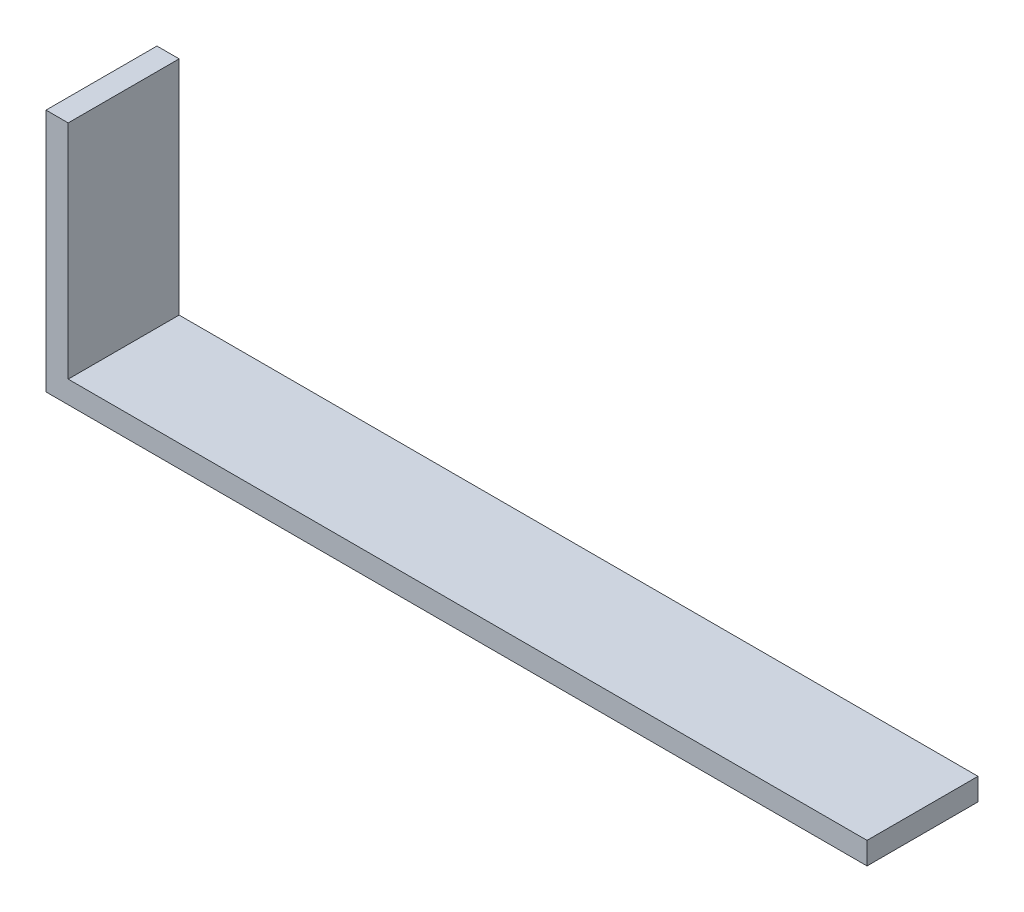
ISO-10303-21;
HEADER;
FILE_DESCRIPTION(('STEP AP214'),'2;1');
FILE_NAME('part.step','',(''),(''),'','','');
FILE_SCHEMA(('AUTOMOTIVE_DESIGN { 1 0 10303 214 1 1 1 1 }'));
ENDSEC;
DATA;
#1=APPLICATION_CONTEXT('core data for automotive mechanical design processes');
#2=APPLICATION_PROTOCOL_DEFINITION('international standard','automotive_design',2000,#1);
#3=PRODUCT_CONTEXT('',#1,'mechanical');
#4=PRODUCT('Part','Part','',(#3));
#5=PRODUCT_RELATED_PRODUCT_CATEGORY('part','',(#4));
#6=PRODUCT_DEFINITION_FORMATION('','',#4);
#7=PRODUCT_DEFINITION_CONTEXT('part definition',#1,'design');
#8=PRODUCT_DEFINITION('design','',#6,#7);
#9=PRODUCT_DEFINITION_SHAPE('','',#8);
#10=(LENGTH_UNIT() NAMED_UNIT(*) SI_UNIT(.MILLI.,.METRE.));
#11=(NAMED_UNIT(*) PLANE_ANGLE_UNIT() SI_UNIT($,.RADIAN.));
#12=(NAMED_UNIT(*) SI_UNIT($,.STERADIAN.) SOLID_ANGLE_UNIT());
#13=UNCERTAINTY_MEASURE_WITH_UNIT(LENGTH_MEASURE(1.E-05),#10,'distance_accuracy_value','');
#14=(GEOMETRIC_REPRESENTATION_CONTEXT(3) GLOBAL_UNCERTAINTY_ASSIGNED_CONTEXT((#13)) GLOBAL_UNIT_ASSIGNED_CONTEXT((#10,
#11,#12)) REPRESENTATION_CONTEXT('',''));
#15=CARTESIAN_POINT('',(0.,0.,0.));
#16=DIRECTION('',(0.,0.,1.));
#17=DIRECTION('',(1.,0.,0.));
#18=AXIS2_PLACEMENT_3D('',#15,#16,#17);
#19=CARTESIAN_POINT('',(1.27,5.98129032258065,6.35));
#20=DIRECTION('',(0.,-1.,0.));
#21=DIRECTION('',(0.,0.,-1.));
#22=AXIS2_PLACEMENT_3D('',#19,#20,#21);
#23=PLANE('',#22);
#24=DIRECTION('',(-1.,0.,0.));
#25=VECTOR('',#24,1.);
#26=CARTESIAN_POINT('',(1.27,5.98129032258065,0.));
#27=LINE('',#26,#25);
#28=CARTESIAN_POINT('',(1.27,5.98129032258065,0.));
#29=VERTEX_POINT('',#28);
#30=CARTESIAN_POINT('',(0.,5.98129032258065,0.));
#31=VERTEX_POINT('',#30);
#32=EDGE_CURVE('E117',#29,#31,#27,.T.);
#33=ORIENTED_EDGE('',*,*,#32,.T.);
#34=DIRECTION('',(0.,0.,-1.));
#35=VECTOR('',#34,1.);
#36=CARTESIAN_POINT('',(0.,5.98129032258065,6.35));
#37=LINE('',#36,#35);
#38=CARTESIAN_POINT('',(0.,5.98129032258065,6.35));
#39=VERTEX_POINT('',#38);
#40=EDGE_CURVE('E11',#39,#31,#37,.T.);
#41=ORIENTED_EDGE('',*,*,#40,.F.);
#42=DIRECTION('',(-1.,0.,0.));
#43=VECTOR('',#42,1.);
#44=CARTESIAN_POINT('',(1.27,5.98129032258065,6.35));
#45=LINE('',#44,#43);
#46=CARTESIAN_POINT('',(1.27,5.98129032258065,6.35));
#47=VERTEX_POINT('',#46);
#48=EDGE_CURVE('E127',#47,#39,#45,.T.);
#49=ORIENTED_EDGE('',*,*,#48,.F.);
#50=DIRECTION('',(0.,0.,-1.));
#51=VECTOR('',#50,1.);
#52=CARTESIAN_POINT('',(1.27,5.98129032258065,6.35));
#53=LINE('',#52,#51);
#54=EDGE_CURVE('E113',#47,#29,#53,.T.);
#55=ORIENTED_EDGE('',*,*,#54,.T.);
#56=EDGE_LOOP('',(#33,#41,#49,#55));
#57=FACE_BOUND('',#56,.T.);
#58=ADVANCED_FACE('F33',(#57),#23,.F.);
#59=CARTESIAN_POINT('',(0.,5.98129032258065,6.35));
#60=DIRECTION('',(1.,0.,0.));
#61=DIRECTION('',(0.,1.,0.));
#62=AXIS2_PLACEMENT_3D('',#59,#60,#61);
#63=PLANE('',#62);
#64=DIRECTION('',(0.,-1.,0.));
#65=VECTOR('',#64,1.);
#66=CARTESIAN_POINT('',(0.,5.98129032258065,0.));
#67=LINE('',#66,#65);
#68=CARTESIAN_POINT('',(0.,-7.98870967741935,0.));
#69=VERTEX_POINT('',#68);
#70=EDGE_CURVE('E120',#31,#69,#67,.T.);
#71=ORIENTED_EDGE('',*,*,#70,.T.);
#72=DIRECTION('',(0.,0.,-1.));
#73=VECTOR('',#72,1.);
#74=CARTESIAN_POINT('',(0.,-7.98870967741935,6.35));
#75=LINE('',#74,#73);
#76=CARTESIAN_POINT('',(0.,-7.98870967741935,6.35));
#77=VERTEX_POINT('',#76);
#78=EDGE_CURVE('E41',#77,#69,#75,.T.);
#79=ORIENTED_EDGE('',*,*,#78,.F.);
#80=DIRECTION('',(0.,-1.,0.));
#81=VECTOR('',#80,1.);
#82=CARTESIAN_POINT('',(0.,5.98129032258065,6.35));
#83=LINE('',#82,#81);
#84=EDGE_CURVE('E86',#39,#77,#83,.T.);
#85=ORIENTED_EDGE('',*,*,#84,.F.);
#86=ORIENTED_EDGE('',*,*,#40,.T.);
#87=EDGE_LOOP('',(#71,#79,#85,#86));
#88=FACE_BOUND('',#87,.T.);
#89=ADVANCED_FACE('F151',(#88),#63,.F.);
#90=CARTESIAN_POINT('',(0.,-7.98870967741935,6.35));
#91=DIRECTION('',(0.,1.,0.));
#92=DIRECTION('',(-1.,0.,0.));
#93=AXIS2_PLACEMENT_3D('',#90,#91,#92);
#94=PLANE('',#93);
#95=DIRECTION('',(1.,0.,0.));
#96=VECTOR('',#95,1.);
#97=CARTESIAN_POINT('',(0.,-7.98870967741935,0.));
#98=LINE('',#97,#96);
#99=CARTESIAN_POINT('',(46.99,-7.98870967741934,0.));
#100=VERTEX_POINT('',#99);
#101=EDGE_CURVE('E122',#69,#100,#98,.T.);
#102=ORIENTED_EDGE('',*,*,#101,.T.);
#103=DIRECTION('',(0.,0.,-1.));
#104=VECTOR('',#103,1.);
#105=CARTESIAN_POINT('',(46.99,-7.98870967741934,6.35));
#106=LINE('',#105,#104);
#107=CARTESIAN_POINT('',(46.99,-7.98870967741934,6.35));
#108=VERTEX_POINT('',#107);
#109=EDGE_CURVE('E108',#108,#100,#106,.T.);
#110=ORIENTED_EDGE('',*,*,#109,.F.);
#111=DIRECTION('',(1.,0.,0.));
#112=VECTOR('',#111,1.);
#113=CARTESIAN_POINT('',(0.,-7.98870967741935,6.35));
#114=LINE('',#113,#112);
#115=EDGE_CURVE('E99',#77,#108,#114,.T.);
#116=ORIENTED_EDGE('',*,*,#115,.F.);
#117=ORIENTED_EDGE('',*,*,#78,.T.);
#118=EDGE_LOOP('',(#102,#110,#116,#117));
#119=FACE_BOUND('',#118,.T.);
#120=ADVANCED_FACE('F133',(#119),#94,.F.);
#121=CARTESIAN_POINT('',(46.99,-7.98870967741934,6.35));
#122=DIRECTION('',(-1.,0.,0.));
#123=DIRECTION('',(0.,0.,1.));
#124=AXIS2_PLACEMENT_3D('',#121,#122,#123);
#125=PLANE('',#124);
#126=DIRECTION('',(0.,1.,0.));
#127=VECTOR('',#126,1.);
#128=CARTESIAN_POINT('',(46.99,-7.98870967741934,0.));
#129=LINE('',#128,#127);
#130=CARTESIAN_POINT('',(46.99,-6.71870967741934,0.));
#131=VERTEX_POINT('',#130);
#132=EDGE_CURVE('E107',#100,#131,#129,.T.);
#133=ORIENTED_EDGE('',*,*,#132,.T.);
#134=DIRECTION('',(0.,0.,-1.));
#135=VECTOR('',#134,1.);
#136=CARTESIAN_POINT('',(46.99,-6.71870967741934,6.35));
#137=LINE('',#136,#135);
#138=CARTESIAN_POINT('',(46.99,-6.71870967741934,6.35));
#139=VERTEX_POINT('',#138);
#140=EDGE_CURVE('E104',#139,#131,#137,.T.);
#141=ORIENTED_EDGE('',*,*,#140,.F.);
#142=DIRECTION('',(0.,1.,0.));
#143=VECTOR('',#142,1.);
#144=CARTESIAN_POINT('',(46.99,-7.98870967741934,6.35));
#145=LINE('',#144,#143);
#146=EDGE_CURVE('E93',#108,#139,#145,.T.);
#147=ORIENTED_EDGE('',*,*,#146,.F.);
#148=ORIENTED_EDGE('',*,*,#109,.T.);
#149=EDGE_LOOP('',(#133,#141,#147,#148));
#150=FACE_BOUND('',#149,.T.);
#151=ADVANCED_FACE('F105',(#150),#125,.F.);
#152=CARTESIAN_POINT('',(46.99,-6.71870967741934,6.35));
#153=DIRECTION('',(0.,-1.,0.));
#154=DIRECTION('',(1.,0.,0.));
#155=AXIS2_PLACEMENT_3D('',#152,#153,#154);
#156=PLANE('',#155);
#157=DIRECTION('',(-1.,0.,0.));
#158=VECTOR('',#157,1.);
#159=CARTESIAN_POINT('',(46.99,-6.71870967741934,0.));
#160=LINE('',#159,#158);
#161=CARTESIAN_POINT('',(1.27,-6.71870967741935,0.));
#162=VERTEX_POINT('',#161);
#163=EDGE_CURVE('E72',#131,#162,#160,.T.);
#164=ORIENTED_EDGE('',*,*,#163,.T.);
#165=DIRECTION('',(0.,0.,-1.));
#166=VECTOR('',#165,1.);
#167=CARTESIAN_POINT('',(1.27,-6.71870967741935,6.35));
#168=LINE('',#167,#166);
#169=CARTESIAN_POINT('',(1.27,-6.71870967741935,6.35));
#170=VERTEX_POINT('',#169);
#171=EDGE_CURVE('E109',#170,#162,#168,.T.);
#172=ORIENTED_EDGE('',*,*,#171,.F.);
#173=DIRECTION('',(-1.,0.,0.));
#174=VECTOR('',#173,1.);
#175=CARTESIAN_POINT('',(46.99,-6.71870967741934,6.35));
#176=LINE('',#175,#174);
#177=EDGE_CURVE('E97',#139,#170,#176,.T.);
#178=ORIENTED_EDGE('',*,*,#177,.F.);
#179=ORIENTED_EDGE('',*,*,#140,.T.);
#180=EDGE_LOOP('',(#164,#172,#178,#179));
#181=FACE_BOUND('',#180,.T.);
#182=ADVANCED_FACE('F111',(#181),#156,.F.);
#183=CARTESIAN_POINT('',(1.27,-6.71870967741935,6.35));
#184=DIRECTION('',(-1.,0.,0.));
#185=DIRECTION('',(0.,-1.,0.));
#186=AXIS2_PLACEMENT_3D('',#183,#184,#185);
#187=PLANE('',#186);
#188=DIRECTION('',(0.,1.,0.));
#189=VECTOR('',#188,1.);
#190=CARTESIAN_POINT('',(1.27,-6.71870967741935,0.));
#191=LINE('',#190,#189);
#192=EDGE_CURVE('E78',#162,#29,#191,.T.);
#193=ORIENTED_EDGE('',*,*,#192,.T.);
#194=ORIENTED_EDGE('',*,*,#54,.F.);
#195=DIRECTION('',(0.,1.,0.));
#196=VECTOR('',#195,1.);
#197=CARTESIAN_POINT('',(1.27,-6.71870967741935,6.35));
#198=LINE('',#197,#196);
#199=EDGE_CURVE('E49',#170,#47,#198,.T.);
#200=ORIENTED_EDGE('',*,*,#199,.F.);
#201=ORIENTED_EDGE('',*,*,#171,.T.);
#202=EDGE_LOOP('',(#193,#194,#200,#201));
#203=FACE_BOUND('',#202,.T.);
#204=ADVANCED_FACE('F140',(#203),#187,.F.);
#205=CARTESIAN_POINT('',(0.,0.,6.35));
#206=DIRECTION('',(0.,0.,1.));
#207=DIRECTION('',(1.,0.,0.));
#208=AXIS2_PLACEMENT_3D('',#205,#206,#207);
#209=PLANE('',#208);
#210=ORIENTED_EDGE('',*,*,#48,.T.);
#211=ORIENTED_EDGE('',*,*,#84,.T.);
#212=ORIENTED_EDGE('',*,*,#115,.T.);
#213=ORIENTED_EDGE('',*,*,#146,.T.);
#214=ORIENTED_EDGE('',*,*,#177,.T.);
#215=ORIENTED_EDGE('',*,*,#199,.T.);
#216=EDGE_LOOP('',(#210,#211,#212,#213,#214,#215));
#217=FACE_BOUND('',#216,.T.);
#218=ADVANCED_FACE('F95',(#217),#209,.T.);
#219=CARTESIAN_POINT('',(0.,0.,0.));
#220=DIRECTION('',(0.,0.,1.));
#221=DIRECTION('',(1.,0.,0.));
#222=AXIS2_PLACEMENT_3D('',#219,#220,#221);
#223=PLANE('',#222);
#224=ORIENTED_EDGE('',*,*,#32,.F.);
#225=ORIENTED_EDGE('',*,*,#192,.F.);
#226=ORIENTED_EDGE('',*,*,#163,.F.);
#227=ORIENTED_EDGE('',*,*,#132,.F.);
#228=ORIENTED_EDGE('',*,*,#101,.F.);
#229=ORIENTED_EDGE('',*,*,#70,.F.);
#230=EDGE_LOOP('',(#224,#225,#226,#227,#228,#229));
#231=FACE_BOUND('',#230,.T.);
#232=ADVANCED_FACE('F136',(#231),#223,.F.);
#233=CLOSED_SHELL('',(#58,#89,#120,#151,#182,#204,#218,#232));
#234=MANIFOLD_SOLID_BREP('B2',#233);
#235=ADVANCED_BREP_SHAPE_REPRESENTATION('',(#18,#234),#14);
#236=SHAPE_DEFINITION_REPRESENTATION(#9,#235);
ENDSEC;
END-ISO-10303-21;
